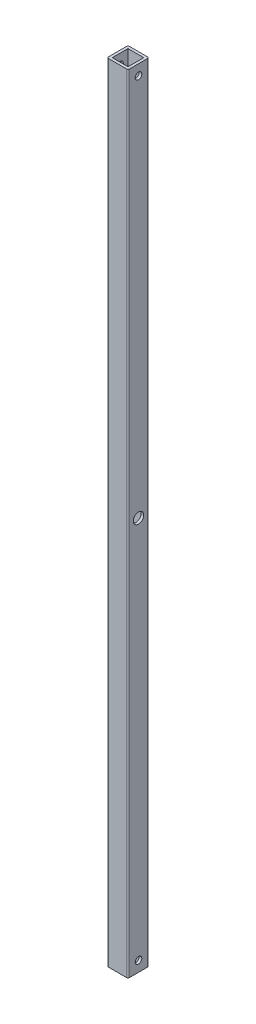
ISO-10303-21;
HEADER;
FILE_DESCRIPTION(('STEP AP214'),'2;1');
FILE_NAME('part.step','',(''),(''),'','','');
FILE_SCHEMA(('AUTOMOTIVE_DESIGN { 1 0 10303 214 1 1 1 1 }'));
ENDSEC;
DATA;
#1=APPLICATION_CONTEXT('core data for automotive mechanical design processes');
#2=APPLICATION_PROTOCOL_DEFINITION('international standard','automotive_design',2000,#1);
#3=PRODUCT_CONTEXT('',#1,'mechanical');
#4=PRODUCT('Part','Part','',(#3));
#5=PRODUCT_RELATED_PRODUCT_CATEGORY('part','',(#4));
#6=PRODUCT_DEFINITION_FORMATION('','',#4);
#7=PRODUCT_DEFINITION_CONTEXT('part definition',#1,'design');
#8=PRODUCT_DEFINITION('design','',#6,#7);
#9=PRODUCT_DEFINITION_SHAPE('','',#8);
#10=(LENGTH_UNIT() NAMED_UNIT(*) SI_UNIT(.MILLI.,.METRE.));
#11=(NAMED_UNIT(*) PLANE_ANGLE_UNIT() SI_UNIT($,.RADIAN.));
#12=(NAMED_UNIT(*) SI_UNIT($,.STERADIAN.) SOLID_ANGLE_UNIT());
#13=UNCERTAINTY_MEASURE_WITH_UNIT(LENGTH_MEASURE(1.E-05),#10,'distance_accuracy_value','');
#14=(GEOMETRIC_REPRESENTATION_CONTEXT(3) GLOBAL_UNCERTAINTY_ASSIGNED_CONTEXT((#13)) GLOBAL_UNIT_ASSIGNED_CONTEXT((#10,
#11,#12)) REPRESENTATION_CONTEXT('',''));
#15=CARTESIAN_POINT('',(0.,0.,0.));
#16=DIRECTION('',(0.,0.,1.));
#17=DIRECTION('',(1.,0.,0.));
#18=AXIS2_PLACEMENT_3D('',#15,#16,#17);
#19=CARTESIAN_POINT('',(0.,600.,0.));
#20=DIRECTION('',(0.,1.,0.));
#21=DIRECTION('',(0.,0.,1.));
#22=AXIS2_PLACEMENT_3D('',#19,#20,#21);
#23=PLANE('',#22);
#24=DIRECTION('',(0.,0.,-1.));
#25=VECTOR('',#24,1.);
#26=CARTESIAN_POINT('',(7.65625,600.,-4.71875));
#27=LINE('',#26,#25);
#28=CARTESIAN_POINT('',(7.65625000000001,600.,10.28125));
#29=VERTEX_POINT('',#28);
#30=CARTESIAN_POINT('',(7.65625,600.,-3.71875));
#31=VERTEX_POINT('',#30);
#32=EDGE_CURVE('E189',#29,#31,#27,.T.);
#33=ORIENTED_EDGE('',*,*,#32,.T.);
#34=CARTESIAN_POINT('',(6.65625,600.,-3.71875));
#35=DIRECTION('',(0.,1.,0.));
#36=DIRECTION('',(0.,0.,1.));
#37=AXIS2_PLACEMENT_3D('',#34,#35,#36);
#38=CIRCLE('',#37,1.);
#39=CARTESIAN_POINT('',(6.65625,600.,-4.71875));
#40=VERTEX_POINT('',#39);
#41=EDGE_CURVE('E227',#31,#40,#38,.T.);
#42=ORIENTED_EDGE('',*,*,#41,.T.);
#43=DIRECTION('',(-1.,0.,0.));
#44=VECTOR('',#43,1.);
#45=CARTESIAN_POINT('',(-8.34375,600.,-4.71875));
#46=LINE('',#45,#44);
#47=CARTESIAN_POINT('',(-7.34375,600.,-4.71875));
#48=VERTEX_POINT('',#47);
#49=EDGE_CURVE('E192',#40,#48,#46,.T.);
#50=ORIENTED_EDGE('',*,*,#49,.T.);
#51=CARTESIAN_POINT('',(-7.34375,600.,-3.71875));
#52=DIRECTION('',(0.,1.,0.));
#53=DIRECTION('',(0.,0.,1.));
#54=AXIS2_PLACEMENT_3D('',#51,#52,#53);
#55=CIRCLE('',#54,1.);
#56=CARTESIAN_POINT('',(-8.34375,600.,-3.71875));
#57=VERTEX_POINT('',#56);
#58=EDGE_CURVE('E225',#48,#57,#55,.T.);
#59=ORIENTED_EDGE('',*,*,#58,.T.);
#60=DIRECTION('',(0.,0.,1.));
#61=VECTOR('',#60,1.);
#62=CARTESIAN_POINT('',(-8.34375,600.,-4.71875));
#63=LINE('',#62,#61);
#64=CARTESIAN_POINT('',(-8.34374999999999,600.,10.28125));
#65=VERTEX_POINT('',#64);
#66=EDGE_CURVE('E184',#57,#65,#63,.T.);
#67=ORIENTED_EDGE('',*,*,#66,.T.);
#68=CARTESIAN_POINT('',(-7.34375,600.,10.28125));
#69=DIRECTION('',(0.,1.,0.));
#70=DIRECTION('',(0.,0.,1.));
#71=AXIS2_PLACEMENT_3D('',#68,#69,#70);
#72=CIRCLE('',#71,1.);
#73=CARTESIAN_POINT('',(-7.34375,600.,11.28125));
#74=VERTEX_POINT('',#73);
#75=EDGE_CURVE('E71',#65,#74,#72,.T.);
#76=ORIENTED_EDGE('',*,*,#75,.T.);
#77=DIRECTION('',(1.,0.,0.));
#78=VECTOR('',#77,1.);
#79=CARTESIAN_POINT('',(-8.34374999999999,600.,11.28125));
#80=LINE('',#79,#78);
#81=CARTESIAN_POINT('',(6.65625,600.,11.28125));
#82=VERTEX_POINT('',#81);
#83=EDGE_CURVE('E186',#74,#82,#80,.T.);
#84=ORIENTED_EDGE('',*,*,#83,.T.);
#85=CARTESIAN_POINT('',(6.65625000000001,600.,10.28125));
#86=DIRECTION('',(0.,1.,0.));
#87=DIRECTION('',(0.,0.,1.));
#88=AXIS2_PLACEMENT_3D('',#85,#86,#87);
#89=CIRCLE('',#88,1.);
#90=EDGE_CURVE('E222',#82,#29,#89,.T.);
#91=ORIENTED_EDGE('',*,*,#90,.T.);
#92=EDGE_LOOP('',(#33,#42,#50,#59,#67,#76,#84,#91));
#93=FACE_BOUND('',#92,.T.);
#94=DIRECTION('',(0.,0.,1.));
#95=VECTOR('',#94,1.);
#96=CARTESIAN_POINT('',(-6.34375,600.,-2.71875));
#97=LINE('',#96,#95);
#98=CARTESIAN_POINT('',(-6.34375,600.,-2.71875));
#99=VERTEX_POINT('',#98);
#100=CARTESIAN_POINT('',(-6.34375,600.,9.28125));
#101=VERTEX_POINT('',#100);
#102=EDGE_CURVE('E151',#99,#101,#97,.T.);
#103=ORIENTED_EDGE('',*,*,#102,.F.);
#104=DIRECTION('',(-1.,0.,0.));
#105=VECTOR('',#104,1.);
#106=CARTESIAN_POINT('',(-6.34375,600.,-2.71875));
#107=LINE('',#106,#105);
#108=CARTESIAN_POINT('',(5.65625,600.,-2.71875));
#109=VERTEX_POINT('',#108);
#110=EDGE_CURVE('E141',#109,#99,#107,.T.);
#111=ORIENTED_EDGE('',*,*,#110,.F.);
#112=DIRECTION('',(0.,0.,-1.));
#113=VECTOR('',#112,1.);
#114=CARTESIAN_POINT('',(5.65625,600.,-2.71875));
#115=LINE('',#114,#113);
#116=CARTESIAN_POINT('',(5.65625,600.,9.28125));
#117=VERTEX_POINT('',#116);
#118=EDGE_CURVE('E166',#117,#109,#115,.T.);
#119=ORIENTED_EDGE('',*,*,#118,.F.);
#120=DIRECTION('',(1.,0.,0.));
#121=VECTOR('',#120,1.);
#122=CARTESIAN_POINT('',(-6.34375,600.,9.28125));
#123=LINE('',#122,#121);
#124=EDGE_CURVE('E164',#101,#117,#123,.T.);
#125=ORIENTED_EDGE('',*,*,#124,.F.);
#126=EDGE_LOOP('',(#103,#111,#119,#125));
#127=FACE_BOUND('',#126,.T.);
#128=ADVANCED_FACE('F48',(#93,#127),#23,.T.);
#129=CARTESIAN_POINT('',(0.,0.,0.));
#130=DIRECTION('',(0.,1.,0.));
#131=DIRECTION('',(0.,0.,1.));
#132=AXIS2_PLACEMENT_3D('',#129,#130,#131);
#133=PLANE('',#132);
#134=DIRECTION('',(-1.,0.,0.));
#135=VECTOR('',#134,1.);
#136=CARTESIAN_POINT('',(-8.34375,0.,-4.71875));
#137=LINE('',#136,#135);
#138=CARTESIAN_POINT('',(6.65625,0.,-4.71875));
#139=VERTEX_POINT('',#138);
#140=CARTESIAN_POINT('',(-7.34375,0.,-4.71875));
#141=VERTEX_POINT('',#140);
#142=EDGE_CURVE('E187',#139,#141,#137,.T.);
#143=ORIENTED_EDGE('',*,*,#142,.F.);
#144=CARTESIAN_POINT('',(6.65625,0.,-3.71875));
#145=DIRECTION('',(0.,1.,0.));
#146=DIRECTION('',(0.,0.,1.));
#147=AXIS2_PLACEMENT_3D('',#144,#145,#146);
#148=CIRCLE('',#147,1.);
#149=CARTESIAN_POINT('',(7.65625,0.,-3.71875));
#150=VERTEX_POINT('',#149);
#151=EDGE_CURVE('E215',#139,#150,#148,.F.);
#152=ORIENTED_EDGE('',*,*,#151,.T.);
#153=DIRECTION('',(0.,0.,-1.));
#154=VECTOR('',#153,1.);
#155=CARTESIAN_POINT('',(7.65625,0.,-4.71875));
#156=LINE('',#155,#154);
#157=CARTESIAN_POINT('',(7.65625000000001,0.,10.28125));
#158=VERTEX_POINT('',#157);
#159=EDGE_CURVE('E200',#158,#150,#156,.T.);
#160=ORIENTED_EDGE('',*,*,#159,.F.);
#161=CARTESIAN_POINT('',(6.65625000000001,0.,10.28125));
#162=DIRECTION('',(0.,1.,0.));
#163=DIRECTION('',(0.,0.,1.));
#164=AXIS2_PLACEMENT_3D('',#161,#162,#163);
#165=CIRCLE('',#164,1.);
#166=CARTESIAN_POINT('',(6.65625,0.,11.28125));
#167=VERTEX_POINT('',#166);
#168=EDGE_CURVE('E209',#158,#167,#165,.F.);
#169=ORIENTED_EDGE('',*,*,#168,.T.);
#170=DIRECTION('',(1.,0.,0.));
#171=VECTOR('',#170,1.);
#172=CARTESIAN_POINT('',(-8.34374999999999,0.,11.28125));
#173=LINE('',#172,#171);
#174=CARTESIAN_POINT('',(-7.34375,0.,11.28125));
#175=VERTEX_POINT('',#174);
#176=EDGE_CURVE('E198',#175,#167,#173,.T.);
#177=ORIENTED_EDGE('',*,*,#176,.F.);
#178=CARTESIAN_POINT('',(-7.34375,0.,10.28125));
#179=DIRECTION('',(0.,1.,0.));
#180=DIRECTION('',(0.,0.,1.));
#181=AXIS2_PLACEMENT_3D('',#178,#179,#180);
#182=CIRCLE('',#181,1.);
#183=CARTESIAN_POINT('',(-8.34374999999999,0.,10.28125));
#184=VERTEX_POINT('',#183);
#185=EDGE_CURVE('E211',#175,#184,#182,.F.);
#186=ORIENTED_EDGE('',*,*,#185,.T.);
#187=DIRECTION('',(0.,0.,1.));
#188=VECTOR('',#187,1.);
#189=CARTESIAN_POINT('',(-8.34375,0.,-4.71875));
#190=LINE('',#189,#188);
#191=CARTESIAN_POINT('',(-8.34375,0.,-3.71875));
#192=VERTEX_POINT('',#191);
#193=EDGE_CURVE('E159',#192,#184,#190,.T.);
#194=ORIENTED_EDGE('',*,*,#193,.F.);
#195=CARTESIAN_POINT('',(-7.34375,0.,-3.71875));
#196=DIRECTION('',(0.,1.,0.));
#197=DIRECTION('',(0.,0.,1.));
#198=AXIS2_PLACEMENT_3D('',#195,#196,#197);
#199=CIRCLE('',#198,1.);
#200=EDGE_CURVE('E213',#192,#141,#199,.F.);
#201=ORIENTED_EDGE('',*,*,#200,.T.);
#202=EDGE_LOOP('',(#143,#152,#160,#169,#177,#186,#194,#201));
#203=FACE_BOUND('',#202,.T.);
#204=DIRECTION('',(-1.,0.,0.));
#205=VECTOR('',#204,1.);
#206=CARTESIAN_POINT('',(-6.34375,0.,-2.71875));
#207=LINE('',#206,#205);
#208=CARTESIAN_POINT('',(5.65625,0.,-2.71875));
#209=VERTEX_POINT('',#208);
#210=CARTESIAN_POINT('',(-6.34375,0.,-2.71875));
#211=VERTEX_POINT('',#210);
#212=EDGE_CURVE('E171',#209,#211,#207,.T.);
#213=ORIENTED_EDGE('',*,*,#212,.T.);
#214=DIRECTION('',(0.,0.,1.));
#215=VECTOR('',#214,1.);
#216=CARTESIAN_POINT('',(-6.34375,0.,-2.71875));
#217=LINE('',#216,#215);
#218=CARTESIAN_POINT('',(-6.34375,0.,9.28125));
#219=VERTEX_POINT('',#218);
#220=EDGE_CURVE('E158',#211,#219,#217,.T.);
#221=ORIENTED_EDGE('',*,*,#220,.T.);
#222=DIRECTION('',(1.,0.,0.));
#223=VECTOR('',#222,1.);
#224=CARTESIAN_POINT('',(-6.34375,0.,9.28125));
#225=LINE('',#224,#223);
#226=CARTESIAN_POINT('',(5.65625,0.,9.28125));
#227=VERTEX_POINT('',#226);
#228=EDGE_CURVE('E175',#219,#227,#225,.T.);
#229=ORIENTED_EDGE('',*,*,#228,.T.);
#230=DIRECTION('',(0.,0.,-1.));
#231=VECTOR('',#230,1.);
#232=CARTESIAN_POINT('',(5.65625,0.,-2.71875));
#233=LINE('',#232,#231);
#234=EDGE_CURVE('E152',#227,#209,#233,.T.);
#235=ORIENTED_EDGE('',*,*,#234,.T.);
#236=EDGE_LOOP('',(#213,#221,#229,#235));
#237=FACE_BOUND('',#236,.T.);
#238=ADVANCED_FACE('F289',(#203,#237),#133,.F.);
#239=CARTESIAN_POINT('',(-8.34375,600.,-4.71875));
#240=DIRECTION('',(1.,0.,0.));
#241=DIRECTION('',(0.,0.,-1.));
#242=AXIS2_PLACEMENT_3D('',#239,#240,#241);
#243=PLANE('',#242);
#244=CARTESIAN_POINT('',(-8.34375,8.,3.28125));
#245=DIRECTION('',(-1.,0.,0.));
#246=DIRECTION('',(0.,0.,1.));
#247=AXIS2_PLACEMENT_3D('',#244,#245,#246);
#248=CIRCLE('',#247,2.5);
#249=CARTESIAN_POINT('',(-8.34375,8.,5.78125));
#250=VERTEX_POINT('',#249);
#251=EDGE_CURVE('E241',#250,#250,#248,.T.);
#252=ORIENTED_EDGE('',*,*,#251,.F.);
#253=EDGE_LOOP('',(#252));
#254=FACE_BOUND('',#253,.T.);
#255=CARTESIAN_POINT('',(-8.34375,592.,3.28125));
#256=DIRECTION('',(-1.,0.,0.));
#257=DIRECTION('',(0.,0.,1.));
#258=AXIS2_PLACEMENT_3D('',#255,#256,#257);
#259=CIRCLE('',#258,2.5);
#260=CARTESIAN_POINT('',(-8.34375,592.,5.78125));
#261=VERTEX_POINT('',#260);
#262=EDGE_CURVE('E248',#261,#261,#259,.T.);
#263=ORIENTED_EDGE('',*,*,#262,.F.);
#264=EDGE_LOOP('',(#263));
#265=FACE_BOUND('',#264,.T.);
#266=CARTESIAN_POINT('',(-8.34375,300.,3.28125));
#267=DIRECTION('',(-1.,0.,0.));
#268=DIRECTION('',(0.,0.,1.));
#269=AXIS2_PLACEMENT_3D('',#266,#267,#268);
#270=CIRCLE('',#269,4.);
#271=CARTESIAN_POINT('',(-8.34375,300.,7.28125));
#272=VERTEX_POINT('',#271);
#273=EDGE_CURVE('E263',#272,#272,#270,.T.);
#274=ORIENTED_EDGE('',*,*,#273,.F.);
#275=EDGE_LOOP('',(#274));
#276=FACE_BOUND('',#275,.T.);
#277=ORIENTED_EDGE('',*,*,#66,.F.);
#278=DIRECTION('',(0.,-1.,0.));
#279=VECTOR('',#278,1.);
#280=CARTESIAN_POINT('',(-8.34375,600.,-3.71875));
#281=LINE('',#280,#279);
#282=EDGE_CURVE('E231',#57,#192,#281,.T.);
#283=ORIENTED_EDGE('',*,*,#282,.T.);
#284=ORIENTED_EDGE('',*,*,#193,.T.);
#285=DIRECTION('',(0.,-1.,0.));
#286=VECTOR('',#285,1.);
#287=CARTESIAN_POINT('',(-8.34374999999999,600.,10.28125));
#288=LINE('',#287,#286);
#289=EDGE_CURVE('E229',#184,#65,#288,.F.);
#290=ORIENTED_EDGE('',*,*,#289,.T.);
#291=EDGE_LOOP('',(#277,#283,#284,#290));
#292=FACE_BOUND('',#291,.T.);
#293=ADVANCED_FACE('F294',(#254,#265,#276,#292),#243,.F.);
#294=CARTESIAN_POINT('',(-8.34374999999999,600.,11.28125));
#295=DIRECTION('',(0.,0.,-1.));
#296=DIRECTION('',(-1.,0.,0.));
#297=AXIS2_PLACEMENT_3D('',#294,#295,#296);
#298=PLANE('',#297);
#299=ORIENTED_EDGE('',*,*,#83,.F.);
#300=DIRECTION('',(0.,-1.,0.));
#301=VECTOR('',#300,1.);
#302=CARTESIAN_POINT('',(-7.34375,600.,11.28125));
#303=LINE('',#302,#301);
#304=EDGE_CURVE('E11',#74,#175,#303,.T.);
#305=ORIENTED_EDGE('',*,*,#304,.T.);
#306=ORIENTED_EDGE('',*,*,#176,.T.);
#307=DIRECTION('',(0.,-1.,0.));
#308=VECTOR('',#307,1.);
#309=CARTESIAN_POINT('',(6.65625,600.,11.28125));
#310=LINE('',#309,#308);
#311=EDGE_CURVE('E57',#167,#82,#310,.F.);
#312=ORIENTED_EDGE('',*,*,#311,.T.);
#313=EDGE_LOOP('',(#299,#305,#306,#312));
#314=FACE_BOUND('',#313,.T.);
#315=ADVANCED_FACE('F304',(#314),#298,.F.);
#316=CARTESIAN_POINT('',(7.65625,600.,-4.71875));
#317=DIRECTION('',(-1.,0.,0.));
#318=DIRECTION('',(0.,0.,1.));
#319=AXIS2_PLACEMENT_3D('',#316,#317,#318);
#320=PLANE('',#319);
#321=CARTESIAN_POINT('',(7.65625,8.,3.28125));
#322=DIRECTION('',(-1.,0.,0.));
#323=DIRECTION('',(0.,0.,1.));
#324=AXIS2_PLACEMENT_3D('',#321,#322,#323);
#325=CIRCLE('',#324,2.5);
#326=CARTESIAN_POINT('',(7.65625,8.,5.78125));
#327=VERTEX_POINT('',#326);
#328=EDGE_CURVE('E260',#327,#327,#325,.T.);
#329=ORIENTED_EDGE('',*,*,#328,.T.);
#330=EDGE_LOOP('',(#329));
#331=FACE_BOUND('',#330,.T.);
#332=CARTESIAN_POINT('',(7.65625,592.,3.28125));
#333=DIRECTION('',(-1.,0.,0.));
#334=DIRECTION('',(0.,0.,1.));
#335=AXIS2_PLACEMENT_3D('',#332,#333,#334);
#336=CIRCLE('',#335,2.5);
#337=CARTESIAN_POINT('',(7.65625,592.,5.78125));
#338=VERTEX_POINT('',#337);
#339=EDGE_CURVE('E245',#338,#338,#336,.T.);
#340=ORIENTED_EDGE('',*,*,#339,.T.);
#341=EDGE_LOOP('',(#340));
#342=FACE_BOUND('',#341,.T.);
#343=CARTESIAN_POINT('',(7.65625,300.,3.28125));
#344=DIRECTION('',(-1.,0.,0.));
#345=DIRECTION('',(0.,0.,1.));
#346=AXIS2_PLACEMENT_3D('',#343,#344,#345);
#347=CIRCLE('',#346,4.);
#348=CARTESIAN_POINT('',(7.65625,300.,7.28125));
#349=VERTEX_POINT('',#348);
#350=EDGE_CURVE('E237',#349,#349,#347,.T.);
#351=ORIENTED_EDGE('',*,*,#350,.T.);
#352=EDGE_LOOP('',(#351));
#353=FACE_BOUND('',#352,.T.);
#354=ORIENTED_EDGE('',*,*,#159,.T.);
#355=DIRECTION('',(0.,-1.,0.));
#356=VECTOR('',#355,1.);
#357=CARTESIAN_POINT('',(7.65625,600.,-3.71875));
#358=LINE('',#357,#356);
#359=EDGE_CURVE('E220',#150,#31,#358,.F.);
#360=ORIENTED_EDGE('',*,*,#359,.T.);
#361=ORIENTED_EDGE('',*,*,#32,.F.);
#362=DIRECTION('',(0.,-1.,0.));
#363=VECTOR('',#362,1.);
#364=CARTESIAN_POINT('',(7.65625000000001,600.,10.28125));
#365=LINE('',#364,#363);
#366=EDGE_CURVE('E217',#29,#158,#365,.T.);
#367=ORIENTED_EDGE('',*,*,#366,.T.);
#368=EDGE_LOOP('',(#354,#360,#361,#367));
#369=FACE_BOUND('',#368,.T.);
#370=ADVANCED_FACE('F300',(#331,#342,#353,#369),#320,.F.);
#371=CARTESIAN_POINT('',(-8.34375,600.,-4.71875));
#372=DIRECTION('',(0.,0.,1.));
#373=DIRECTION('',(1.,0.,0.));
#374=AXIS2_PLACEMENT_3D('',#371,#372,#373);
#375=PLANE('',#374);
#376=ORIENTED_EDGE('',*,*,#49,.F.);
#377=DIRECTION('',(0.,-1.,0.));
#378=VECTOR('',#377,1.);
#379=CARTESIAN_POINT('',(6.65625,600.,-4.71875));
#380=LINE('',#379,#378);
#381=EDGE_CURVE('E206',#40,#139,#380,.T.);
#382=ORIENTED_EDGE('',*,*,#381,.T.);
#383=ORIENTED_EDGE('',*,*,#142,.T.);
#384=DIRECTION('',(0.,-1.,0.));
#385=VECTOR('',#384,1.);
#386=CARTESIAN_POINT('',(-7.34375,600.,-4.71875));
#387=LINE('',#386,#385);
#388=EDGE_CURVE('E195',#141,#48,#387,.F.);
#389=ORIENTED_EDGE('',*,*,#388,.T.);
#390=EDGE_LOOP('',(#376,#382,#383,#389));
#391=FACE_BOUND('',#390,.T.);
#392=ADVANCED_FACE('F284',(#391),#375,.F.);
#393=CARTESIAN_POINT('',(-6.34375,600.,-2.71875));
#394=DIRECTION('',(0.,0.,1.));
#395=DIRECTION('',(1.,0.,0.));
#396=AXIS2_PLACEMENT_3D('',#393,#394,#395);
#397=PLANE('',#396);
#398=ORIENTED_EDGE('',*,*,#212,.F.);
#399=DIRECTION('',(0.,-1.,0.));
#400=VECTOR('',#399,1.);
#401=CARTESIAN_POINT('',(5.65625,600.,-2.71875));
#402=LINE('',#401,#400);
#403=EDGE_CURVE('E147',#109,#209,#402,.T.);
#404=ORIENTED_EDGE('',*,*,#403,.F.);
#405=ORIENTED_EDGE('',*,*,#110,.T.);
#406=DIRECTION('',(0.,-1.,0.));
#407=VECTOR('',#406,1.);
#408=CARTESIAN_POINT('',(-6.34375,600.,-2.71875));
#409=LINE('',#408,#407);
#410=EDGE_CURVE('E144',#99,#211,#409,.T.);
#411=ORIENTED_EDGE('',*,*,#410,.T.);
#412=EDGE_LOOP('',(#398,#404,#405,#411));
#413=FACE_BOUND('',#412,.T.);
#414=ADVANCED_FACE('F143',(#413),#397,.T.);
#415=CARTESIAN_POINT('',(-6.34375,600.,-2.71875));
#416=DIRECTION('',(1.,0.,0.));
#417=DIRECTION('',(0.,0.,-1.));
#418=AXIS2_PLACEMENT_3D('',#415,#416,#417);
#419=PLANE('',#418);
#420=CARTESIAN_POINT('',(-6.34375,8.,3.28125));
#421=DIRECTION('',(1.,0.,0.));
#422=DIRECTION('',(0.,0.,-1.));
#423=AXIS2_PLACEMENT_3D('',#420,#421,#422);
#424=CIRCLE('',#423,2.5);
#425=CARTESIAN_POINT('',(-6.34375,8.,0.781249999999996));
#426=VERTEX_POINT('',#425);
#427=EDGE_CURVE('E257',#426,#426,#424,.T.);
#428=ORIENTED_EDGE('',*,*,#427,.F.);
#429=EDGE_LOOP('',(#428));
#430=FACE_BOUND('',#429,.T.);
#431=CARTESIAN_POINT('',(-6.34375,592.,3.28125));
#432=DIRECTION('',(1.,0.,0.));
#433=DIRECTION('',(0.,0.,-1.));
#434=AXIS2_PLACEMENT_3D('',#431,#432,#433);
#435=CIRCLE('',#434,2.5);
#436=CARTESIAN_POINT('',(-6.34375,592.,0.781249999999996));
#437=VERTEX_POINT('',#436);
#438=EDGE_CURVE('E240',#437,#437,#435,.T.);
#439=ORIENTED_EDGE('',*,*,#438,.F.);
#440=EDGE_LOOP('',(#439));
#441=FACE_BOUND('',#440,.T.);
#442=CARTESIAN_POINT('',(-6.34375,300.,3.28125));
#443=DIRECTION('',(1.,0.,0.));
#444=DIRECTION('',(0.,0.,-1.));
#445=AXIS2_PLACEMENT_3D('',#442,#443,#444);
#446=CIRCLE('',#445,4.);
#447=CARTESIAN_POINT('',(-6.34375,300.,-0.718750000000006));
#448=VERTEX_POINT('',#447);
#449=EDGE_CURVE('E173',#448,#448,#446,.T.);
#450=ORIENTED_EDGE('',*,*,#449,.F.);
#451=EDGE_LOOP('',(#450));
#452=FACE_BOUND('',#451,.T.);
#453=ORIENTED_EDGE('',*,*,#220,.F.);
#454=ORIENTED_EDGE('',*,*,#410,.F.);
#455=ORIENTED_EDGE('',*,*,#102,.T.);
#456=DIRECTION('',(0.,-1.,0.));
#457=VECTOR('',#456,1.);
#458=CARTESIAN_POINT('',(-6.34375,600.,9.28125));
#459=LINE('',#458,#457);
#460=EDGE_CURVE('E160',#101,#219,#459,.T.);
#461=ORIENTED_EDGE('',*,*,#460,.T.);
#462=EDGE_LOOP('',(#453,#454,#455,#461));
#463=FACE_BOUND('',#462,.T.);
#464=ADVANCED_FACE('F155',(#430,#441,#452,#463),#419,.T.);
#465=CARTESIAN_POINT('',(-6.34375,600.,9.28125));
#466=DIRECTION('',(0.,0.,-1.));
#467=DIRECTION('',(-1.,0.,0.));
#468=AXIS2_PLACEMENT_3D('',#465,#466,#467);
#469=PLANE('',#468);
#470=ORIENTED_EDGE('',*,*,#228,.F.);
#471=ORIENTED_EDGE('',*,*,#460,.F.);
#472=ORIENTED_EDGE('',*,*,#124,.T.);
#473=DIRECTION('',(0.,-1.,0.));
#474=VECTOR('',#473,1.);
#475=CARTESIAN_POINT('',(5.65625,600.,9.28125));
#476=LINE('',#475,#474);
#477=EDGE_CURVE('E181',#117,#227,#476,.T.);
#478=ORIENTED_EDGE('',*,*,#477,.T.);
#479=EDGE_LOOP('',(#470,#471,#472,#478));
#480=FACE_BOUND('',#479,.T.);
#481=ADVANCED_FACE('F274',(#480),#469,.T.);
#482=CARTESIAN_POINT('',(5.65625,600.,-2.71875));
#483=DIRECTION('',(-1.,0.,0.));
#484=DIRECTION('',(0.,0.,1.));
#485=AXIS2_PLACEMENT_3D('',#482,#483,#484);
#486=PLANE('',#485);
#487=CARTESIAN_POINT('',(5.65625,8.,3.28125));
#488=DIRECTION('',(-1.,0.,0.));
#489=DIRECTION('',(0.,0.,1.));
#490=AXIS2_PLACEMENT_3D('',#487,#488,#489);
#491=CIRCLE('',#490,2.5);
#492=CARTESIAN_POINT('',(5.65625,8.,5.78125));
#493=VERTEX_POINT('',#492);
#494=EDGE_CURVE('E52',#493,#493,#491,.T.);
#495=ORIENTED_EDGE('',*,*,#494,.F.);
#496=EDGE_LOOP('',(#495));
#497=FACE_BOUND('',#496,.T.);
#498=CARTESIAN_POINT('',(5.65625,592.,3.28125));
#499=DIRECTION('',(-1.,0.,0.));
#500=DIRECTION('',(0.,0.,1.));
#501=AXIS2_PLACEMENT_3D('',#498,#499,#500);
#502=CIRCLE('',#501,2.5);
#503=CARTESIAN_POINT('',(5.65625,592.,5.78125));
#504=VERTEX_POINT('',#503);
#505=EDGE_CURVE('E238',#504,#504,#502,.T.);
#506=ORIENTED_EDGE('',*,*,#505,.F.);
#507=EDGE_LOOP('',(#506));
#508=FACE_BOUND('',#507,.T.);
#509=CARTESIAN_POINT('',(5.65625,300.,3.28125));
#510=DIRECTION('',(-1.,0.,0.));
#511=DIRECTION('',(0.,0.,1.));
#512=AXIS2_PLACEMENT_3D('',#509,#510,#511);
#513=CIRCLE('',#512,4.);
#514=CARTESIAN_POINT('',(5.65625,300.,7.28125));
#515=VERTEX_POINT('',#514);
#516=EDGE_CURVE('E235',#515,#515,#513,.T.);
#517=ORIENTED_EDGE('',*,*,#516,.F.);
#518=EDGE_LOOP('',(#517));
#519=FACE_BOUND('',#518,.T.);
#520=ORIENTED_EDGE('',*,*,#234,.F.);
#521=ORIENTED_EDGE('',*,*,#477,.F.);
#522=ORIENTED_EDGE('',*,*,#118,.T.);
#523=ORIENTED_EDGE('',*,*,#403,.T.);
#524=EDGE_LOOP('',(#520,#521,#522,#523));
#525=FACE_BOUND('',#524,.T.);
#526=ADVANCED_FACE('F281',(#497,#508,#519,#525),#486,.T.);
#527=CARTESIAN_POINT('',(6.65625,600.,-3.71875));
#528=DIRECTION('',(0.,-1.,0.));
#529=DIRECTION('',(0.,0.,-1.));
#530=AXIS2_PLACEMENT_3D('',#527,#528,#529);
#531=CYLINDRICAL_SURFACE('',#530,1.);
#532=ORIENTED_EDGE('',*,*,#41,.F.);
#533=ORIENTED_EDGE('',*,*,#359,.F.);
#534=ORIENTED_EDGE('',*,*,#151,.F.);
#535=ORIENTED_EDGE('',*,*,#381,.F.);
#536=EDGE_LOOP('',(#532,#533,#534,#535));
#537=FACE_BOUND('',#536,.T.);
#538=ADVANCED_FACE('F311',(#537),#531,.T.);
#539=CARTESIAN_POINT('',(-7.34375,600.,-3.71875));
#540=DIRECTION('',(0.,-1.,0.));
#541=DIRECTION('',(0.,0.,-1.));
#542=AXIS2_PLACEMENT_3D('',#539,#540,#541);
#543=CYLINDRICAL_SURFACE('',#542,1.);
#544=ORIENTED_EDGE('',*,*,#58,.F.);
#545=ORIENTED_EDGE('',*,*,#388,.F.);
#546=ORIENTED_EDGE('',*,*,#200,.F.);
#547=ORIENTED_EDGE('',*,*,#282,.F.);
#548=EDGE_LOOP('',(#544,#545,#546,#547));
#549=FACE_BOUND('',#548,.T.);
#550=ADVANCED_FACE('F314',(#549),#543,.T.);
#551=CARTESIAN_POINT('',(-7.34375,600.,10.28125));
#552=DIRECTION('',(0.,-1.,0.));
#553=DIRECTION('',(0.,0.,-1.));
#554=AXIS2_PLACEMENT_3D('',#551,#552,#553);
#555=CYLINDRICAL_SURFACE('',#554,1.);
#556=ORIENTED_EDGE('',*,*,#75,.F.);
#557=ORIENTED_EDGE('',*,*,#289,.F.);
#558=ORIENTED_EDGE('',*,*,#185,.F.);
#559=ORIENTED_EDGE('',*,*,#304,.F.);
#560=EDGE_LOOP('',(#556,#557,#558,#559));
#561=FACE_BOUND('',#560,.T.);
#562=ADVANCED_FACE('F317',(#561),#555,.T.);
#563=CARTESIAN_POINT('',(6.65625000000001,600.,10.28125));
#564=DIRECTION('',(0.,-1.,0.));
#565=DIRECTION('',(0.,0.,-1.));
#566=AXIS2_PLACEMENT_3D('',#563,#564,#565);
#567=CYLINDRICAL_SURFACE('',#566,1.);
#568=ORIENTED_EDGE('',*,*,#90,.F.);
#569=ORIENTED_EDGE('',*,*,#311,.F.);
#570=ORIENTED_EDGE('',*,*,#168,.F.);
#571=ORIENTED_EDGE('',*,*,#366,.F.);
#572=EDGE_LOOP('',(#568,#569,#570,#571));
#573=FACE_BOUND('',#572,.T.);
#574=ADVANCED_FACE('F50',(#573),#567,.T.);
#575=CARTESIAN_POINT('',(7.65625,300.,3.28125));
#576=DIRECTION('',(-1.,0.,0.));
#577=DIRECTION('',(0.,0.,1.));
#578=AXIS2_PLACEMENT_3D('',#575,#576,#577);
#579=CYLINDRICAL_SURFACE('',#578,4.);
#580=ORIENTED_EDGE('',*,*,#516,.T.);
#581=EDGE_LOOP('',(#580));
#582=FACE_BOUND('',#581,.T.);
#583=ORIENTED_EDGE('',*,*,#350,.F.);
#584=EDGE_LOOP('',(#583));
#585=FACE_BOUND('',#584,.T.);
#586=ADVANCED_FACE('F324',(#582,#585),#579,.F.);
#587=ORIENTED_EDGE('',*,*,#449,.T.);
#588=EDGE_LOOP('',(#587));
#589=FACE_BOUND('',#588,.T.);
#590=ORIENTED_EDGE('',*,*,#273,.T.);
#591=EDGE_LOOP('',(#590));
#592=FACE_BOUND('',#591,.T.);
#593=ADVANCED_FACE('F270',(#589,#592),#579,.F.);
#594=CARTESIAN_POINT('',(11.65625,592.,3.28125));
#595=DIRECTION('',(-1.,0.,0.));
#596=DIRECTION('',(0.,0.,1.));
#597=AXIS2_PLACEMENT_3D('',#594,#595,#596);
#598=CYLINDRICAL_SURFACE('',#597,2.5);
#599=ORIENTED_EDGE('',*,*,#505,.T.);
#600=EDGE_LOOP('',(#599));
#601=FACE_BOUND('',#600,.T.);
#602=ORIENTED_EDGE('',*,*,#339,.F.);
#603=EDGE_LOOP('',(#602));
#604=FACE_BOUND('',#603,.T.);
#605=ADVANCED_FACE('F360',(#601,#604),#598,.F.);
#606=CARTESIAN_POINT('',(11.65625,8.,3.28125));
#607=DIRECTION('',(-1.,0.,0.));
#608=DIRECTION('',(0.,0.,1.));
#609=AXIS2_PLACEMENT_3D('',#606,#607,#608);
#610=CYLINDRICAL_SURFACE('',#609,2.5);
#611=ORIENTED_EDGE('',*,*,#494,.T.);
#612=EDGE_LOOP('',(#611));
#613=FACE_BOUND('',#612,.T.);
#614=ORIENTED_EDGE('',*,*,#328,.F.);
#615=EDGE_LOOP('',(#614));
#616=FACE_BOUND('',#615,.T.);
#617=ADVANCED_FACE('F363',(#613,#616),#610,.F.);
#618=ORIENTED_EDGE('',*,*,#438,.T.);
#619=EDGE_LOOP('',(#618));
#620=FACE_BOUND('',#619,.T.);
#621=ORIENTED_EDGE('',*,*,#262,.T.);
#622=EDGE_LOOP('',(#621));
#623=FACE_BOUND('',#622,.T.);
#624=ADVANCED_FACE('F364',(#620,#623),#598,.F.);
#625=ORIENTED_EDGE('',*,*,#427,.T.);
#626=EDGE_LOOP('',(#625));
#627=FACE_BOUND('',#626,.T.);
#628=ORIENTED_EDGE('',*,*,#251,.T.);
#629=EDGE_LOOP('',(#628));
#630=FACE_BOUND('',#629,.T.);
#631=ADVANCED_FACE('F367',(#627,#630),#610,.F.);
#632=CLOSED_SHELL('',(#128,#238,#293,#315,#370,#392,#414,#464,#481,#526,#538,#550,#562,#574,
#586,#593,#605,#617,#624,#631));
#633=MANIFOLD_SOLID_BREP('B2',#632);
#634=ADVANCED_BREP_SHAPE_REPRESENTATION('',(#18,#633),#14);
#635=SHAPE_DEFINITION_REPRESENTATION(#9,#634);
ENDSEC;
END-ISO-10303-21;
